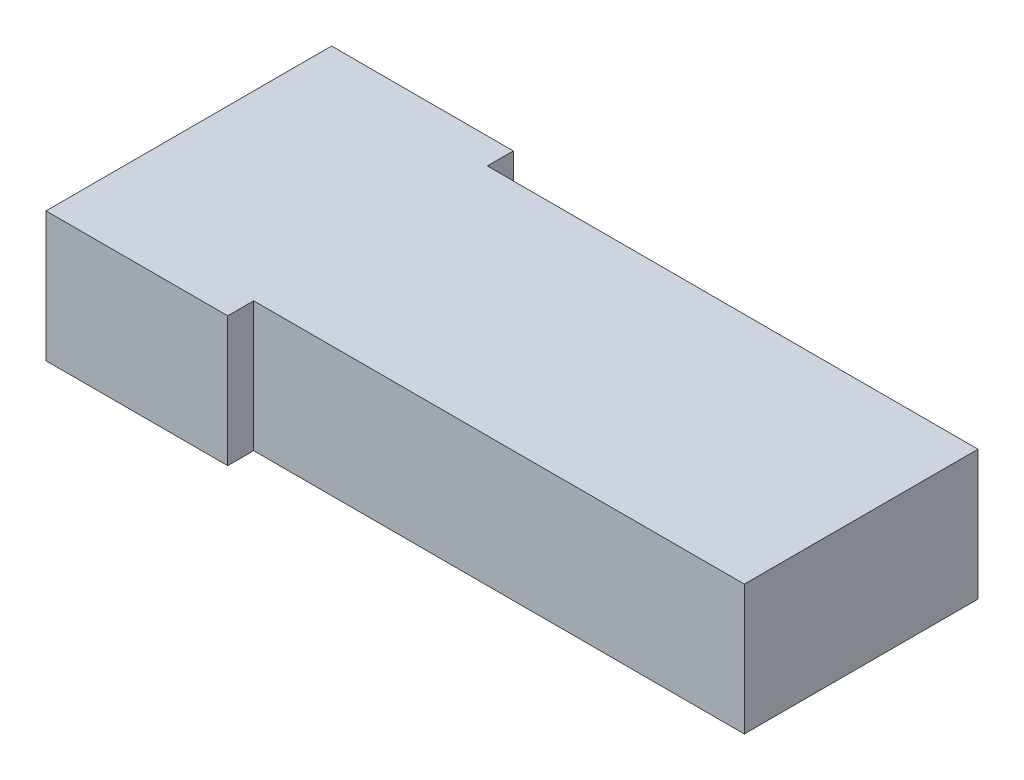
ISO-10303-21;
HEADER;
FILE_DESCRIPTION(('STEP AP214'),'2;1');
FILE_NAME('part.step','',(''),(''),'','','');
FILE_SCHEMA(('AUTOMOTIVE_DESIGN { 1 0 10303 214 1 1 1 1 }'));
ENDSEC;
DATA;
#1=APPLICATION_CONTEXT('core data for automotive mechanical design processes');
#2=APPLICATION_PROTOCOL_DEFINITION('international standard','automotive_design',2000,#1);
#3=PRODUCT_CONTEXT('',#1,'mechanical');
#4=PRODUCT('Part','Part','',(#3));
#5=PRODUCT_RELATED_PRODUCT_CATEGORY('part','',(#4));
#6=PRODUCT_DEFINITION_FORMATION('','',#4);
#7=PRODUCT_DEFINITION_CONTEXT('part definition',#1,'design');
#8=PRODUCT_DEFINITION('design','',#6,#7);
#9=PRODUCT_DEFINITION_SHAPE('','',#8);
#10=(LENGTH_UNIT() NAMED_UNIT(*) SI_UNIT(.MILLI.,.METRE.));
#11=(NAMED_UNIT(*) PLANE_ANGLE_UNIT() SI_UNIT($,.RADIAN.));
#12=(NAMED_UNIT(*) SI_UNIT($,.STERADIAN.) SOLID_ANGLE_UNIT());
#13=UNCERTAINTY_MEASURE_WITH_UNIT(LENGTH_MEASURE(1.E-05),#10,'distance_accuracy_value','');
#14=(GEOMETRIC_REPRESENTATION_CONTEXT(3) GLOBAL_UNCERTAINTY_ASSIGNED_CONTEXT((#13)) GLOBAL_UNIT_ASSIGNED_CONTEXT((#10,
#11,#12)) REPRESENTATION_CONTEXT('',''));
#15=CARTESIAN_POINT('',(0.,0.,0.));
#16=DIRECTION('',(0.,0.,1.));
#17=DIRECTION('',(1.,0.,0.));
#18=AXIS2_PLACEMENT_3D('',#15,#16,#17);
#19=CARTESIAN_POINT('',(0.,0.,0.));
#20=DIRECTION('',(0.,-1.,0.));
#21=DIRECTION('',(0.,0.,-1.));
#22=AXIS2_PLACEMENT_3D('',#19,#20,#21);
#23=PLANE('',#22);
#24=DIRECTION('',(0.,0.,1.));
#25=VECTOR('',#24,1.);
#26=CARTESIAN_POINT('',(7.5,0.,-4.5));
#27=LINE('',#26,#25);
#28=CARTESIAN_POINT('',(7.5,0.,-4.5));
#29=VERTEX_POINT('',#28);
#30=CARTESIAN_POINT('',(7.5,0.,-1.6));
#31=VERTEX_POINT('',#30);
#32=EDGE_CURVE('E309',#29,#31,#27,.T.);
#33=ORIENTED_EDGE('',*,*,#32,.T.);
#34=DIRECTION('',(-1.,0.,0.));
#35=VECTOR('',#34,1.);
#36=CARTESIAN_POINT('',(0.5,0.,-1.6));
#37=LINE('',#36,#35);
#38=CARTESIAN_POINT('',(0.5,0.,-1.6));
#39=VERTEX_POINT('',#38);
#40=EDGE_CURVE('E303',#31,#39,#37,.T.);
#41=ORIENTED_EDGE('',*,*,#40,.T.);
#42=DIRECTION('',(0.,0.,1.));
#43=VECTOR('',#42,1.);
#44=CARTESIAN_POINT('',(0.5,0.,1.6));
#45=LINE('',#44,#43);
#46=CARTESIAN_POINT('',(0.5,0.,1.6));
#47=VERTEX_POINT('',#46);
#48=EDGE_CURVE('E332',#39,#47,#45,.T.);
#49=ORIENTED_EDGE('',*,*,#48,.T.);
#50=DIRECTION('',(1.,0.,0.));
#51=VECTOR('',#50,1.);
#52=CARTESIAN_POINT('',(7.5,0.,1.6));
#53=LINE('',#52,#51);
#54=CARTESIAN_POINT('',(8.5,0.,1.6));
#55=VERTEX_POINT('',#54);
#56=EDGE_CURVE('E336',#47,#55,#53,.T.);
#57=ORIENTED_EDGE('',*,*,#56,.T.);
#58=DIRECTION('',(0.,0.,-1.));
#59=VECTOR('',#58,1.);
#60=CARTESIAN_POINT('',(8.5,0.,1.6));
#61=LINE('',#60,#59);
#62=CARTESIAN_POINT('',(8.5,0.,-4.5));
#63=VERTEX_POINT('',#62);
#64=EDGE_CURVE('E340',#55,#63,#61,.T.);
#65=ORIENTED_EDGE('',*,*,#64,.T.);
#66=DIRECTION('',(-1.,0.,0.));
#67=VECTOR('',#66,1.);
#68=CARTESIAN_POINT('',(-7.5,0.,-4.5));
#69=LINE('',#68,#67);
#70=CARTESIAN_POINT('',(9.9,0.,-4.5));
#71=VERTEX_POINT('',#70);
#72=EDGE_CURVE('E525',#71,#63,#69,.T.);
#73=ORIENTED_EDGE('',*,*,#72,.F.);
#74=DIRECTION('',(0.,0.,1.));
#75=VECTOR('',#74,1.);
#76=CARTESIAN_POINT('',(9.9,0.,-4.5));
#77=LINE('',#76,#75);
#78=CARTESIAN_POINT('',(9.9,0.,3.));
#79=VERTEX_POINT('',#78);
#80=EDGE_CURVE('E350',#71,#79,#77,.T.);
#81=ORIENTED_EDGE('',*,*,#80,.T.);
#82=DIRECTION('',(-1.,0.,0.));
#83=VECTOR('',#82,1.);
#84=CARTESIAN_POINT('',(7.5,0.,3.));
#85=LINE('',#84,#83);
#86=CARTESIAN_POINT('',(0.5,0.,3.));
#87=VERTEX_POINT('',#86);
#88=EDGE_CURVE('E410',#79,#87,#85,.T.);
#89=ORIENTED_EDGE('',*,*,#88,.T.);
#90=DIRECTION('',(0.,0.,1.));
#91=VECTOR('',#90,1.);
#92=CARTESIAN_POINT('',(0.5,0.,3.5));
#93=LINE('',#92,#91);
#94=CARTESIAN_POINT('',(0.5,0.,3.5));
#95=VERTEX_POINT('',#94);
#96=EDGE_CURVE('E414',#87,#95,#93,.T.);
#97=ORIENTED_EDGE('',*,*,#96,.T.);
#98=DIRECTION('',(-1.,0.,0.));
#99=VECTOR('',#98,1.);
#100=CARTESIAN_POINT('',(-14.5,0.,3.5));
#101=LINE('',#100,#99);
#102=CARTESIAN_POINT('',(-14.5,0.,3.5));
#103=VERTEX_POINT('',#102);
#104=EDGE_CURVE('E372',#95,#103,#101,.T.);
#105=ORIENTED_EDGE('',*,*,#104,.T.);
#106=DIRECTION('',(0.,0.,1.));
#107=VECTOR('',#106,1.);
#108=CARTESIAN_POINT('',(-14.5,0.,-5.5));
#109=LINE('',#108,#107);
#110=CARTESIAN_POINT('',(-14.5,0.,-3.5));
#111=VERTEX_POINT('',#110);
#112=EDGE_CURVE('E503',#111,#103,#109,.T.);
#113=ORIENTED_EDGE('',*,*,#112,.F.);
#114=DIRECTION('',(1.,0.,0.));
#115=VECTOR('',#114,1.);
#116=CARTESIAN_POINT('',(-14.5,0.,-3.5));
#117=LINE('',#116,#115);
#118=CARTESIAN_POINT('',(0.499999999999999,0.,-3.5));
#119=VERTEX_POINT('',#118);
#120=EDGE_CURVE('E472',#111,#119,#117,.T.);
#121=ORIENTED_EDGE('',*,*,#120,.T.);
#122=DIRECTION('',(0.,0.,1.));
#123=VECTOR('',#122,1.);
#124=CARTESIAN_POINT('',(0.499999999999999,0.,-3.5));
#125=LINE('',#124,#123);
#126=CARTESIAN_POINT('',(0.5,0.,-3.));
#127=VERTEX_POINT('',#126);
#128=EDGE_CURVE('E476',#119,#127,#125,.T.);
#129=ORIENTED_EDGE('',*,*,#128,.T.);
#130=DIRECTION('',(1.,0.,0.));
#131=VECTOR('',#130,1.);
#132=CARTESIAN_POINT('',(6.1,0.,-3.));
#133=LINE('',#132,#131);
#134=CARTESIAN_POINT('',(6.1,0.,-3.));
#135=VERTEX_POINT('',#134);
#136=EDGE_CURVE('E442',#127,#135,#133,.T.);
#137=ORIENTED_EDGE('',*,*,#136,.T.);
#138=DIRECTION('',(0.,0.,-1.));
#139=VECTOR('',#138,1.);
#140=CARTESIAN_POINT('',(6.1,0.,-4.5));
#141=LINE('',#140,#139);
#142=CARTESIAN_POINT('',(6.1,0.,-4.5));
#143=VERTEX_POINT('',#142);
#144=EDGE_CURVE('E424',#135,#143,#141,.T.);
#145=ORIENTED_EDGE('',*,*,#144,.T.);
#146=EDGE_CURVE('E487',#29,#143,#69,.T.);
#147=ORIENTED_EDGE('',*,*,#146,.F.);
#148=EDGE_LOOP('',(#33,#41,#49,#57,#65,#73,#81,#89,#97,#105,#113,#121,#129,#137,#145,#147));
#149=FACE_BOUND('',#148,.T.);
#150=ADVANCED_FACE('F39',(#149),#23,.T.);
#151=CARTESIAN_POINT('',(-7.5,2.,-4.5));
#152=DIRECTION('',(0.,0.,1.));
#153=DIRECTION('',(1.,0.,0.));
#154=AXIS2_PLACEMENT_3D('',#151,#152,#153);
#155=PLANE('',#154);
#156=DIRECTION('',(0.,-1.,0.));
#157=VECTOR('',#156,1.);
#158=CARTESIAN_POINT('',(11.4,2.,-4.5));
#159=LINE('',#158,#157);
#160=CARTESIAN_POINT('',(11.4,2.,-4.5));
#161=VERTEX_POINT('',#160);
#162=CARTESIAN_POINT('',(11.4,-3.,-4.5));
#163=VERTEX_POINT('',#162);
#164=EDGE_CURVE('E524',#161,#163,#159,.T.);
#165=ORIENTED_EDGE('',*,*,#164,.T.);
#166=DIRECTION('',(-1.,0.,0.));
#167=VECTOR('',#166,1.);
#168=CARTESIAN_POINT('',(11.4,-3.,-4.5));
#169=LINE('',#168,#167);
#170=CARTESIAN_POINT('',(9.9,-3.,-4.5));
#171=VERTEX_POINT('',#170);
#172=EDGE_CURVE('E371',#163,#171,#169,.T.);
#173=ORIENTED_EDGE('',*,*,#172,.T.);
#174=DIRECTION('',(0.,1.,0.));
#175=VECTOR('',#174,1.);
#176=CARTESIAN_POINT('',(9.9,-3.,-4.5));
#177=LINE('',#176,#175);
#178=EDGE_CURVE('E406',#171,#71,#177,.T.);
#179=ORIENTED_EDGE('',*,*,#178,.T.);
#180=ORIENTED_EDGE('',*,*,#72,.T.);
#181=DIRECTION('',(0.,1.,0.));
#182=VECTOR('',#181,1.);
#183=CARTESIAN_POINT('',(8.5,-3.,-4.5));
#184=LINE('',#183,#182);
#185=CARTESIAN_POINT('',(8.5,-3.,-4.5));
#186=VERTEX_POINT('',#185);
#187=EDGE_CURVE('E355',#186,#63,#184,.T.);
#188=ORIENTED_EDGE('',*,*,#187,.F.);
#189=DIRECTION('',(-1.,0.,0.));
#190=VECTOR('',#189,1.);
#191=CARTESIAN_POINT('',(8.5,-3.,-4.5));
#192=LINE('',#191,#190);
#193=CARTESIAN_POINT('',(7.5,-3.,-4.5));
#194=VERTEX_POINT('',#193);
#195=EDGE_CURVE('E320',#186,#194,#192,.T.);
#196=ORIENTED_EDGE('',*,*,#195,.T.);
#197=DIRECTION('',(0.,1.,0.));
#198=VECTOR('',#197,1.);
#199=CARTESIAN_POINT('',(7.5,-3.,-4.5));
#200=LINE('',#199,#198);
#201=EDGE_CURVE('E351',#194,#29,#200,.T.);
#202=ORIENTED_EDGE('',*,*,#201,.T.);
#203=ORIENTED_EDGE('',*,*,#146,.T.);
#204=DIRECTION('',(0.,1.,0.));
#205=VECTOR('',#204,1.);
#206=CARTESIAN_POINT('',(6.1,-3.,-4.5));
#207=LINE('',#206,#205);
#208=CARTESIAN_POINT('',(6.1,-3.,-4.5));
#209=VERTEX_POINT('',#208);
#210=EDGE_CURVE('E468',#209,#143,#207,.T.);
#211=ORIENTED_EDGE('',*,*,#210,.F.);
#212=DIRECTION('',(-1.,0.,0.));
#213=VECTOR('',#212,1.);
#214=CARTESIAN_POINT('',(6.1,-3.,-4.5));
#215=LINE('',#214,#213);
#216=CARTESIAN_POINT('',(-7.5,-3.,-4.5));
#217=VERTEX_POINT('',#216);
#218=EDGE_CURVE('E441',#209,#217,#215,.T.);
#219=ORIENTED_EDGE('',*,*,#218,.T.);
#220=DIRECTION('',(0.,-1.,0.));
#221=VECTOR('',#220,1.);
#222=CARTESIAN_POINT('',(-7.5,2.,-4.5));
#223=LINE('',#222,#221);
#224=CARTESIAN_POINT('',(-7.5,2.,-4.5));
#225=VERTEX_POINT('',#224);
#226=EDGE_CURVE('E552',#225,#217,#223,.T.);
#227=ORIENTED_EDGE('',*,*,#226,.F.);
#228=DIRECTION('',(-1.,0.,0.));
#229=VECTOR('',#228,1.);
#230=CARTESIAN_POINT('',(7.5,2.,-4.5));
#231=LINE('',#230,#229);
#232=EDGE_CURVE('E499',#161,#225,#231,.T.);
#233=ORIENTED_EDGE('',*,*,#232,.F.);
#234=EDGE_LOOP('',(#165,#173,#179,#180,#188,#196,#202,#203,#211,#219,#227,#233));
#235=FACE_BOUND('',#234,.T.);
#236=ADVANCED_FACE('F41',(#235),#155,.F.);
#237=CARTESIAN_POINT('',(-7.5,2.,-4.5));
#238=DIRECTION('',(-1.,0.,0.));
#239=DIRECTION('',(0.,0.,1.));
#240=AXIS2_PLACEMENT_3D('',#237,#238,#239);
#241=PLANE('',#240);
#242=DIRECTION('',(0.,0.,-1.));
#243=VECTOR('',#242,1.);
#244=CARTESIAN_POINT('',(-7.5,-3.,-4.5));
#245=LINE('',#244,#243);
#246=CARTESIAN_POINT('',(-7.5,-3.,-5.5));
#247=VERTEX_POINT('',#246);
#248=EDGE_CURVE('E446',#217,#247,#245,.T.);
#249=ORIENTED_EDGE('',*,*,#248,.T.);
#250=DIRECTION('',(0.,-1.,0.));
#251=VECTOR('',#250,1.);
#252=CARTESIAN_POINT('',(-7.5,2.,-5.5));
#253=LINE('',#252,#251);
#254=CARTESIAN_POINT('',(-7.5,2.,-5.5));
#255=VERTEX_POINT('',#254);
#256=EDGE_CURVE('E549',#255,#247,#253,.T.);
#257=ORIENTED_EDGE('',*,*,#256,.F.);
#258=DIRECTION('',(0.,0.,-1.));
#259=VECTOR('',#258,1.);
#260=CARTESIAN_POINT('',(-7.5,2.,-4.5));
#261=LINE('',#260,#259);
#262=EDGE_CURVE('E502',#225,#255,#261,.T.);
#263=ORIENTED_EDGE('',*,*,#262,.F.);
#264=ORIENTED_EDGE('',*,*,#226,.T.);
#265=EDGE_LOOP('',(#249,#257,#263,#264));
#266=FACE_BOUND('',#265,.T.);
#267=ADVANCED_FACE('F600',(#266),#241,.F.);
#268=CARTESIAN_POINT('',(-7.5,2.,-5.5));
#269=DIRECTION('',(0.,0.,1.));
#270=DIRECTION('',(1.,0.,0.));
#271=AXIS2_PLACEMENT_3D('',#268,#269,#270);
#272=PLANE('',#271);
#273=DIRECTION('',(-1.,0.,0.));
#274=VECTOR('',#273,1.);
#275=CARTESIAN_POINT('',(-7.5,-3.,-5.5));
#276=LINE('',#275,#274);
#277=CARTESIAN_POINT('',(-14.5,-3.,-5.5));
#278=VERTEX_POINT('',#277);
#279=EDGE_CURVE('E450',#247,#278,#276,.T.);
#280=ORIENTED_EDGE('',*,*,#279,.T.);
#281=DIRECTION('',(0.,-1.,0.));
#282=VECTOR('',#281,1.);
#283=CARTESIAN_POINT('',(-14.5,2.,-5.5));
#284=LINE('',#283,#282);
#285=CARTESIAN_POINT('',(-14.5,2.,-5.5));
#286=VERTEX_POINT('',#285);
#287=EDGE_CURVE('E546',#286,#278,#284,.T.);
#288=ORIENTED_EDGE('',*,*,#287,.F.);
#289=DIRECTION('',(-1.,0.,0.));
#290=VECTOR('',#289,1.);
#291=CARTESIAN_POINT('',(-7.5,2.,-5.5));
#292=LINE('',#291,#290);
#293=EDGE_CURVE('E506',#255,#286,#292,.T.);
#294=ORIENTED_EDGE('',*,*,#293,.F.);
#295=ORIENTED_EDGE('',*,*,#256,.T.);
#296=EDGE_LOOP('',(#280,#288,#294,#295));
#297=FACE_BOUND('',#296,.T.);
#298=ADVANCED_FACE('F596',(#297),#272,.F.);
#299=CARTESIAN_POINT('',(-14.5,2.,-5.5));
#300=DIRECTION('',(1.,0.,0.));
#301=DIRECTION('',(0.,0.,-1.));
#302=AXIS2_PLACEMENT_3D('',#299,#300,#301);
#303=PLANE('',#302);
#304=DIRECTION('',(0.,0.,1.));
#305=VECTOR('',#304,1.);
#306=CARTESIAN_POINT('',(-14.5,-3.,-5.5));
#307=LINE('',#306,#305);
#308=CARTESIAN_POINT('',(-14.5,-3.,-2.39113648292669));
#309=VERTEX_POINT('',#308);
#310=EDGE_CURVE('E454',#278,#309,#307,.T.);
#311=ORIENTED_EDGE('',*,*,#310,.T.);
#312=DIRECTION('',(0.,-1.,0.));
#313=VECTOR('',#312,1.);
#314=CARTESIAN_POINT('',(-14.5,-1.,-2.39113648292669));
#315=LINE('',#314,#313);
#316=CARTESIAN_POINT('',(-14.5,-1.,-2.39113648292669));
#317=VERTEX_POINT('',#316);
#318=EDGE_CURVE('E253',#317,#309,#315,.T.);
#319=ORIENTED_EDGE('',*,*,#318,.F.);
#320=DIRECTION('',(0.,0.,-1.));
#321=VECTOR('',#320,1.);
#322=CARTESIAN_POINT('',(-14.5,-1.,-5.5));
#323=LINE('',#322,#321);
#324=CARTESIAN_POINT('',(-14.5,-1.,-3.5));
#325=VERTEX_POINT('',#324);
#326=EDGE_CURVE('E254',#317,#325,#323,.T.);
#327=ORIENTED_EDGE('',*,*,#326,.T.);
#328=DIRECTION('',(0.,1.,0.));
#329=VECTOR('',#328,1.);
#330=CARTESIAN_POINT('',(-14.5,-3.,-3.5));
#331=LINE('',#330,#329);
#332=EDGE_CURVE('E58',#325,#111,#331,.T.);
#333=ORIENTED_EDGE('',*,*,#332,.T.);
#334=ORIENTED_EDGE('',*,*,#112,.T.);
#335=DIRECTION('',(0.,1.,0.));
#336=VECTOR('',#335,1.);
#337=CARTESIAN_POINT('',(-14.5,-3.,3.5));
#338=LINE('',#337,#336);
#339=CARTESIAN_POINT('',(-14.5,-1.,3.5));
#340=VERTEX_POINT('',#339);
#341=EDGE_CURVE('E421',#340,#103,#338,.T.);
#342=ORIENTED_EDGE('',*,*,#341,.F.);
#343=DIRECTION('',(0.,0.,-1.));
#344=VECTOR('',#343,1.);
#345=CARTESIAN_POINT('',(-14.5,-1.,5.5));
#346=LINE('',#345,#344);
#347=CARTESIAN_POINT('',(-14.5,-1.,2.39113648292669));
#348=VERTEX_POINT('',#347);
#349=EDGE_CURVE('E274',#340,#348,#346,.T.);
#350=ORIENTED_EDGE('',*,*,#349,.T.);
#351=DIRECTION('',(0.,-1.,0.));
#352=VECTOR('',#351,1.);
#353=CARTESIAN_POINT('',(-14.5,-1.,2.39113648292669));
#354=LINE('',#353,#352);
#355=CARTESIAN_POINT('',(-14.5,-3.,2.39113648292669));
#356=VERTEX_POINT('',#355);
#357=EDGE_CURVE('E286',#348,#356,#354,.T.);
#358=ORIENTED_EDGE('',*,*,#357,.T.);
#359=DIRECTION('',(0.,0.,1.));
#360=VECTOR('',#359,1.);
#361=CARTESIAN_POINT('',(-14.5,-3.,5.5));
#362=LINE('',#361,#360);
#363=CARTESIAN_POINT('',(-14.5,-3.,5.5));
#364=VERTEX_POINT('',#363);
#365=EDGE_CURVE('E390',#356,#364,#362,.T.);
#366=ORIENTED_EDGE('',*,*,#365,.T.);
#367=DIRECTION('',(0.,-1.,0.));
#368=VECTOR('',#367,1.);
#369=CARTESIAN_POINT('',(-14.5,2.,5.5));
#370=LINE('',#369,#368);
#371=CARTESIAN_POINT('',(-14.5,2.,5.5));
#372=VERTEX_POINT('',#371);
#373=EDGE_CURVE('E543',#372,#364,#370,.T.);
#374=ORIENTED_EDGE('',*,*,#373,.F.);
#375=DIRECTION('',(0.,0.,1.));
#376=VECTOR('',#375,1.);
#377=CARTESIAN_POINT('',(-14.5,2.,-5.5));
#378=LINE('',#377,#376);
#379=EDGE_CURVE('E509',#286,#372,#378,.T.);
#380=ORIENTED_EDGE('',*,*,#379,.F.);
#381=ORIENTED_EDGE('',*,*,#287,.T.);
#382=EDGE_LOOP('',(#311,#319,#327,#333,#334,#342,#350,#358,#366,#374,#380,#381));
#383=FACE_BOUND('',#382,.T.);
#384=ADVANCED_FACE('F564',(#383),#303,.F.);
#385=CARTESIAN_POINT('',(-14.5,2.,5.5));
#386=DIRECTION('',(0.,0.,-1.));
#387=DIRECTION('',(-1.,0.,0.));
#388=AXIS2_PLACEMENT_3D('',#385,#386,#387);
#389=PLANE('',#388);
#390=DIRECTION('',(1.,0.,0.));
#391=VECTOR('',#390,1.);
#392=CARTESIAN_POINT('',(-7.5,-3.,5.5));
#393=LINE('',#392,#391);
#394=CARTESIAN_POINT('',(-7.5,-3.,5.5));
#395=VERTEX_POINT('',#394);
#396=EDGE_CURVE('E394',#364,#395,#393,.T.);
#397=ORIENTED_EDGE('',*,*,#396,.T.);
#398=DIRECTION('',(0.,-1.,0.));
#399=VECTOR('',#398,1.);
#400=CARTESIAN_POINT('',(-7.5,2.,5.5));
#401=LINE('',#400,#399);
#402=CARTESIAN_POINT('',(-7.5,2.,5.5));
#403=VERTEX_POINT('',#402);
#404=EDGE_CURVE('E540',#403,#395,#401,.T.);
#405=ORIENTED_EDGE('',*,*,#404,.F.);
#406=DIRECTION('',(1.,0.,0.));
#407=VECTOR('',#406,1.);
#408=CARTESIAN_POINT('',(-14.5,2.,5.5));
#409=LINE('',#408,#407);
#410=EDGE_CURVE('E512',#372,#403,#409,.T.);
#411=ORIENTED_EDGE('',*,*,#410,.F.);
#412=ORIENTED_EDGE('',*,*,#373,.T.);
#413=EDGE_LOOP('',(#397,#405,#411,#412));
#414=FACE_BOUND('',#413,.T.);
#415=ADVANCED_FACE('F583',(#414),#389,.F.);
#416=CARTESIAN_POINT('',(-7.5,2.,5.5));
#417=DIRECTION('',(-1.,0.,0.));
#418=DIRECTION('',(0.,0.,1.));
#419=AXIS2_PLACEMENT_3D('',#416,#417,#418);
#420=PLANE('',#419);
#421=DIRECTION('',(0.,0.,-1.));
#422=VECTOR('',#421,1.);
#423=CARTESIAN_POINT('',(-7.5,-3.,4.5));
#424=LINE('',#423,#422);
#425=CARTESIAN_POINT('',(-7.5,-3.,4.5));
#426=VERTEX_POINT('',#425);
#427=EDGE_CURVE('E398',#395,#426,#424,.T.);
#428=ORIENTED_EDGE('',*,*,#427,.T.);
#429=DIRECTION('',(0.,-1.,0.));
#430=VECTOR('',#429,1.);
#431=CARTESIAN_POINT('',(-7.5,2.,4.5));
#432=LINE('',#431,#430);
#433=CARTESIAN_POINT('',(-7.5,2.,4.5));
#434=VERTEX_POINT('',#433);
#435=EDGE_CURVE('E537',#434,#426,#432,.T.);
#436=ORIENTED_EDGE('',*,*,#435,.F.);
#437=DIRECTION('',(0.,0.,-1.));
#438=VECTOR('',#437,1.);
#439=CARTESIAN_POINT('',(-7.5,2.,5.5));
#440=LINE('',#439,#438);
#441=EDGE_CURVE('E515',#403,#434,#440,.T.);
#442=ORIENTED_EDGE('',*,*,#441,.F.);
#443=ORIENTED_EDGE('',*,*,#404,.T.);
#444=EDGE_LOOP('',(#428,#436,#442,#443));
#445=FACE_BOUND('',#444,.T.);
#446=ADVANCED_FACE('F645',(#445),#420,.F.);
#447=CARTESIAN_POINT('',(11.4,2.,4.5));
#448=DIRECTION('',(0.,0.,-1.));
#449=DIRECTION('',(-1.,0.,0.));
#450=AXIS2_PLACEMENT_3D('',#447,#448,#449);
#451=PLANE('',#450);
#452=ORIENTED_EDGE('',*,*,#435,.T.);
#453=DIRECTION('',(1.,0.,0.));
#454=VECTOR('',#453,1.);
#455=CARTESIAN_POINT('',(-7.5,-3.,4.5));
#456=LINE('',#455,#454);
#457=CARTESIAN_POINT('',(11.4,-3.,4.5));
#458=VERTEX_POINT('',#457);
#459=EDGE_CURVE('E402',#426,#458,#456,.T.);
#460=ORIENTED_EDGE('',*,*,#459,.T.);
#461=DIRECTION('',(0.,-1.,0.));
#462=VECTOR('',#461,1.);
#463=CARTESIAN_POINT('',(11.4,2.,4.5));
#464=LINE('',#463,#462);
#465=CARTESIAN_POINT('',(11.4,2.,4.5));
#466=VERTEX_POINT('',#465);
#467=EDGE_CURVE('E534',#466,#458,#464,.T.);
#468=ORIENTED_EDGE('',*,*,#467,.F.);
#469=DIRECTION('',(1.,0.,0.));
#470=VECTOR('',#469,1.);
#471=CARTESIAN_POINT('',(-7.5,2.,4.5));
#472=LINE('',#471,#470);
#473=EDGE_CURVE('E518',#434,#466,#472,.T.);
#474=ORIENTED_EDGE('',*,*,#473,.F.);
#475=EDGE_LOOP('',(#452,#460,#468,#474));
#476=FACE_BOUND('',#475,.T.);
#477=ADVANCED_FACE('F643',(#476),#451,.F.);
#478=CARTESIAN_POINT('',(11.4,2.,-4.5));
#479=DIRECTION('',(-1.,0.,0.));
#480=DIRECTION('',(0.,0.,1.));
#481=AXIS2_PLACEMENT_3D('',#478,#479,#480);
#482=PLANE('',#481);
#483=ORIENTED_EDGE('',*,*,#467,.T.);
#484=DIRECTION('',(0.,0.,-1.));
#485=VECTOR('',#484,1.);
#486=CARTESIAN_POINT('',(11.4,-3.,4.5));
#487=LINE('',#486,#485);
#488=EDGE_CURVE('E367',#458,#163,#487,.T.);
#489=ORIENTED_EDGE('',*,*,#488,.T.);
#490=ORIENTED_EDGE('',*,*,#164,.F.);
#491=DIRECTION('',(0.,0.,-1.));
#492=VECTOR('',#491,1.);
#493=CARTESIAN_POINT('',(11.4,2.,-4.5));
#494=LINE('',#493,#492);
#495=EDGE_CURVE('E521',#466,#161,#494,.T.);
#496=ORIENTED_EDGE('',*,*,#495,.F.);
#497=EDGE_LOOP('',(#483,#489,#490,#496));
#498=FACE_BOUND('',#497,.T.);
#499=ADVANCED_FACE('F638',(#498),#482,.F.);
#500=CARTESIAN_POINT('',(0.,2.,0.));
#501=DIRECTION('',(0.,-1.,0.));
#502=DIRECTION('',(0.,0.,-1.));
#503=AXIS2_PLACEMENT_3D('',#500,#501,#502);
#504=PLANE('',#503);
#505=ORIENTED_EDGE('',*,*,#232,.T.);
#506=ORIENTED_EDGE('',*,*,#262,.T.);
#507=ORIENTED_EDGE('',*,*,#293,.T.);
#508=ORIENTED_EDGE('',*,*,#379,.T.);
#509=ORIENTED_EDGE('',*,*,#410,.T.);
#510=ORIENTED_EDGE('',*,*,#441,.T.);
#511=ORIENTED_EDGE('',*,*,#473,.T.);
#512=ORIENTED_EDGE('',*,*,#495,.T.);
#513=EDGE_LOOP('',(#505,#506,#507,#508,#509,#510,#511,#512));
#514=FACE_BOUND('',#513,.T.);
#515=ADVANCED_FACE('F586',(#514),#504,.F.);
#516=CARTESIAN_POINT('',(6.1,-3.,-4.5));
#517=DIRECTION('',(1.,0.,0.));
#518=DIRECTION('',(0.,0.,-1.));
#519=AXIS2_PLACEMENT_3D('',#516,#517,#518);
#520=PLANE('',#519);
#521=ORIENTED_EDGE('',*,*,#144,.F.);
#522=DIRECTION('',(0.,1.,0.));
#523=VECTOR('',#522,1.);
#524=CARTESIAN_POINT('',(6.1,-3.,-3.));
#525=LINE('',#524,#523);
#526=CARTESIAN_POINT('',(6.1,-3.,-3.));
#527=VERTEX_POINT('',#526);
#528=EDGE_CURVE('E483',#527,#135,#525,.T.);
#529=ORIENTED_EDGE('',*,*,#528,.F.);
#530=DIRECTION('',(0.,0.,-1.));
#531=VECTOR('',#530,1.);
#532=CARTESIAN_POINT('',(6.1,-3.,-4.5));
#533=LINE('',#532,#531);
#534=EDGE_CURVE('E437',#527,#209,#533,.T.);
#535=ORIENTED_EDGE('',*,*,#534,.T.);
#536=ORIENTED_EDGE('',*,*,#210,.T.);
#537=EDGE_LOOP('',(#521,#529,#535,#536));
#538=FACE_BOUND('',#537,.T.);
#539=ADVANCED_FACE('F608',(#538),#520,.T.);
#540=CARTESIAN_POINT('',(6.1,-3.,-3.));
#541=DIRECTION('',(0.,0.,1.));
#542=DIRECTION('',(1.,0.,0.));
#543=AXIS2_PLACEMENT_3D('',#540,#541,#542);
#544=PLANE('',#543);
#545=ORIENTED_EDGE('',*,*,#136,.F.);
#546=DIRECTION('',(0.,1.,0.));
#547=VECTOR('',#546,1.);
#548=CARTESIAN_POINT('',(0.5,-3.,-3.));
#549=LINE('',#548,#547);
#550=CARTESIAN_POINT('',(0.5,-3.,-3.));
#551=VERTEX_POINT('',#550);
#552=EDGE_CURVE('E488',#551,#127,#549,.T.);
#553=ORIENTED_EDGE('',*,*,#552,.F.);
#554=DIRECTION('',(1.,0.,0.));
#555=VECTOR('',#554,1.);
#556=CARTESIAN_POINT('',(6.1,-3.,-3.));
#557=LINE('',#556,#555);
#558=EDGE_CURVE('E464',#551,#527,#557,.T.);
#559=ORIENTED_EDGE('',*,*,#558,.T.);
#560=ORIENTED_EDGE('',*,*,#528,.T.);
#561=EDGE_LOOP('',(#545,#553,#559,#560));
#562=FACE_BOUND('',#561,.T.);
#563=ADVANCED_FACE('F613',(#562),#544,.T.);
#564=CARTESIAN_POINT('',(0.499999999999999,-3.,-3.5));
#565=DIRECTION('',(-1.,0.,0.));
#566=DIRECTION('',(0.,0.,1.));
#567=AXIS2_PLACEMENT_3D('',#564,#565,#566);
#568=PLANE('',#567);
#569=ORIENTED_EDGE('',*,*,#128,.F.);
#570=DIRECTION('',(0.,1.,0.));
#571=VECTOR('',#570,1.);
#572=CARTESIAN_POINT('',(0.499999999999999,-3.,-3.5));
#573=LINE('',#572,#571);
#574=CARTESIAN_POINT('',(0.499999999999999,-3.,-3.5));
#575=VERTEX_POINT('',#574);
#576=EDGE_CURVE('E491',#575,#119,#573,.T.);
#577=ORIENTED_EDGE('',*,*,#576,.F.);
#578=DIRECTION('',(0.,0.,1.));
#579=VECTOR('',#578,1.);
#580=CARTESIAN_POINT('',(0.499999999999999,-3.,-3.5));
#581=LINE('',#580,#579);
#582=EDGE_CURVE('E460',#575,#551,#581,.T.);
#583=ORIENTED_EDGE('',*,*,#582,.T.);
#584=ORIENTED_EDGE('',*,*,#552,.T.);
#585=EDGE_LOOP('',(#569,#577,#583,#584));
#586=FACE_BOUND('',#585,.T.);
#587=ADVANCED_FACE('F618',(#586),#568,.T.);
#588=CARTESIAN_POINT('',(-14.5,-3.,-3.5));
#589=DIRECTION('',(0.,0.,1.));
#590=DIRECTION('',(1.,0.,0.));
#591=AXIS2_PLACEMENT_3D('',#588,#589,#590);
#592=PLANE('',#591);
#593=DIRECTION('',(0.,1.,0.));
#594=VECTOR('',#593,1.);
#595=CARTESIAN_POINT('',(-7.5,-3.,-3.5));
#596=LINE('',#595,#594);
#597=CARTESIAN_POINT('',(-7.5,-3.,-3.5));
#598=VERTEX_POINT('',#597);
#599=CARTESIAN_POINT('',(-7.5,-1.,-3.5));
#600=VERTEX_POINT('',#599);
#601=EDGE_CURVE('E240',#598,#600,#596,.T.);
#602=ORIENTED_EDGE('',*,*,#601,.F.);
#603=DIRECTION('',(1.,0.,0.));
#604=VECTOR('',#603,1.);
#605=CARTESIAN_POINT('',(-14.5,-3.,-3.5));
#606=LINE('',#605,#604);
#607=EDGE_CURVE('E457',#598,#575,#606,.T.);
#608=ORIENTED_EDGE('',*,*,#607,.T.);
#609=ORIENTED_EDGE('',*,*,#576,.T.);
#610=ORIENTED_EDGE('',*,*,#120,.F.);
#611=ORIENTED_EDGE('',*,*,#332,.F.);
#612=DIRECTION('',(1.,0.,0.));
#613=VECTOR('',#612,1.);
#614=CARTESIAN_POINT('',(-14.5,-1.,-3.5));
#615=LINE('',#614,#613);
#616=EDGE_CURVE('E11',#325,#600,#615,.T.);
#617=ORIENTED_EDGE('',*,*,#616,.T.);
#618=EDGE_LOOP('',(#602,#608,#609,#610,#611,#617));
#619=FACE_BOUND('',#618,.T.);
#620=ADVANCED_FACE('F619',(#619),#592,.T.);
#621=CARTESIAN_POINT('',(0.,-3.,0.));
#622=DIRECTION('',(0.,-1.,0.));
#623=DIRECTION('',(0.,0.,-1.));
#624=AXIS2_PLACEMENT_3D('',#621,#622,#623);
#625=PLANE('',#624);
#626=ORIENTED_EDGE('',*,*,#607,.F.);
#627=DIRECTION('',(0.,0.,1.));
#628=VECTOR('',#627,1.);
#629=CARTESIAN_POINT('',(-7.5,-3.,-5.5));
#630=LINE('',#629,#628);
#631=CARTESIAN_POINT('',(-7.5,-3.,-2.39113648292669));
#632=VERTEX_POINT('',#631);
#633=EDGE_CURVE('E264',#598,#632,#630,.T.);
#634=ORIENTED_EDGE('',*,*,#633,.T.);
#635=DIRECTION('',(-1.,0.,0.));
#636=VECTOR('',#635,1.);
#637=CARTESIAN_POINT('',(-7.5,-3.,-2.39113648292669));
#638=LINE('',#637,#636);
#639=EDGE_CURVE('E245',#632,#309,#638,.T.);
#640=ORIENTED_EDGE('',*,*,#639,.T.);
#641=ORIENTED_EDGE('',*,*,#310,.F.);
#642=ORIENTED_EDGE('',*,*,#279,.F.);
#643=ORIENTED_EDGE('',*,*,#248,.F.);
#644=ORIENTED_EDGE('',*,*,#218,.F.);
#645=ORIENTED_EDGE('',*,*,#534,.F.);
#646=ORIENTED_EDGE('',*,*,#558,.F.);
#647=ORIENTED_EDGE('',*,*,#582,.F.);
#648=EDGE_LOOP('',(#626,#634,#640,#641,#642,#643,#644,#645,#646,#647));
#649=FACE_BOUND('',#648,.T.);
#650=ADVANCED_FACE('F594',(#649),#625,.T.);
#651=CARTESIAN_POINT('',(-14.5,-3.,3.5));
#652=DIRECTION('',(0.,0.,-1.));
#653=DIRECTION('',(-1.,0.,0.));
#654=AXIS2_PLACEMENT_3D('',#651,#652,#653);
#655=PLANE('',#654);
#656=DIRECTION('',(0.,-1.,0.));
#657=VECTOR('',#656,1.);
#658=CARTESIAN_POINT('',(-7.5,-3.,3.5));
#659=LINE('',#658,#657);
#660=CARTESIAN_POINT('',(-7.5,-1.,3.5));
#661=VERTEX_POINT('',#660);
#662=CARTESIAN_POINT('',(-7.5,-3.,3.5));
#663=VERTEX_POINT('',#662);
#664=EDGE_CURVE('E296',#661,#663,#659,.T.);
#665=ORIENTED_EDGE('',*,*,#664,.F.);
#666=DIRECTION('',(-1.,0.,0.));
#667=VECTOR('',#666,1.);
#668=CARTESIAN_POINT('',(-14.5,-1.,3.5));
#669=LINE('',#668,#667);
#670=EDGE_CURVE('E48',#661,#340,#669,.T.);
#671=ORIENTED_EDGE('',*,*,#670,.T.);
#672=ORIENTED_EDGE('',*,*,#341,.T.);
#673=ORIENTED_EDGE('',*,*,#104,.F.);
#674=DIRECTION('',(0.,1.,0.));
#675=VECTOR('',#674,1.);
#676=CARTESIAN_POINT('',(0.5,-3.,3.5));
#677=LINE('',#676,#675);
#678=CARTESIAN_POINT('',(0.5,-3.,3.5));
#679=VERTEX_POINT('',#678);
#680=EDGE_CURVE('E425',#679,#95,#677,.T.);
#681=ORIENTED_EDGE('',*,*,#680,.F.);
#682=DIRECTION('',(-1.,0.,0.));
#683=VECTOR('',#682,1.);
#684=CARTESIAN_POINT('',(-14.5,-3.,3.5));
#685=LINE('',#684,#683);
#686=EDGE_CURVE('E387',#679,#663,#685,.T.);
#687=ORIENTED_EDGE('',*,*,#686,.T.);
#688=EDGE_LOOP('',(#665,#671,#672,#673,#681,#687));
#689=FACE_BOUND('',#688,.T.);
#690=ADVANCED_FACE('F558',(#689),#655,.T.);
#691=CARTESIAN_POINT('',(0.5,-3.,3.5));
#692=DIRECTION('',(-1.,0.,0.));
#693=DIRECTION('',(0.,0.,1.));
#694=AXIS2_PLACEMENT_3D('',#691,#692,#693);
#695=PLANE('',#694);
#696=ORIENTED_EDGE('',*,*,#96,.F.);
#697=DIRECTION('',(0.,1.,0.));
#698=VECTOR('',#697,1.);
#699=CARTESIAN_POINT('',(0.5,-3.,3.));
#700=LINE('',#699,#698);
#701=CARTESIAN_POINT('',(0.5,-3.,3.));
#702=VERTEX_POINT('',#701);
#703=EDGE_CURVE('E428',#702,#87,#700,.T.);
#704=ORIENTED_EDGE('',*,*,#703,.F.);
#705=DIRECTION('',(0.,0.,1.));
#706=VECTOR('',#705,1.);
#707=CARTESIAN_POINT('',(0.5,-3.,3.5));
#708=LINE('',#707,#706);
#709=EDGE_CURVE('E383',#702,#679,#708,.T.);
#710=ORIENTED_EDGE('',*,*,#709,.T.);
#711=ORIENTED_EDGE('',*,*,#680,.T.);
#712=EDGE_LOOP('',(#696,#704,#710,#711));
#713=FACE_BOUND('',#712,.T.);
#714=ADVANCED_FACE('F626',(#713),#695,.T.);
#715=CARTESIAN_POINT('',(7.5,-3.,3.));
#716=DIRECTION('',(0.,0.,-1.));
#717=DIRECTION('',(-1.,0.,0.));
#718=AXIS2_PLACEMENT_3D('',#715,#716,#717);
#719=PLANE('',#718);
#720=ORIENTED_EDGE('',*,*,#88,.F.);
#721=DIRECTION('',(0.,1.,0.));
#722=VECTOR('',#721,1.);
#723=CARTESIAN_POINT('',(9.9,-3.,3.));
#724=LINE('',#723,#722);
#725=CARTESIAN_POINT('',(9.9,-3.,3.));
#726=VERTEX_POINT('',#725);
#727=EDGE_CURVE('E431',#726,#79,#724,.T.);
#728=ORIENTED_EDGE('',*,*,#727,.F.);
#729=DIRECTION('',(-1.,0.,0.));
#730=VECTOR('',#729,1.);
#731=CARTESIAN_POINT('',(9.9,-3.,3.));
#732=LINE('',#731,#730);
#733=EDGE_CURVE('E380',#726,#702,#732,.T.);
#734=ORIENTED_EDGE('',*,*,#733,.T.);
#735=ORIENTED_EDGE('',*,*,#703,.T.);
#736=EDGE_LOOP('',(#720,#728,#734,#735));
#737=FACE_BOUND('',#736,.T.);
#738=ADVANCED_FACE('F628',(#737),#719,.T.);
#739=CARTESIAN_POINT('',(9.9,-3.,-4.5));
#740=DIRECTION('',(-1.,0.,0.));
#741=DIRECTION('',(0.,0.,1.));
#742=AXIS2_PLACEMENT_3D('',#739,#740,#741);
#743=PLANE('',#742);
#744=ORIENTED_EDGE('',*,*,#80,.F.);
#745=ORIENTED_EDGE('',*,*,#178,.F.);
#746=DIRECTION('',(0.,0.,1.));
#747=VECTOR('',#746,1.);
#748=CARTESIAN_POINT('',(9.9,-3.,-4.5));
#749=LINE('',#748,#747);
#750=EDGE_CURVE('E376',#171,#726,#749,.T.);
#751=ORIENTED_EDGE('',*,*,#750,.T.);
#752=ORIENTED_EDGE('',*,*,#727,.T.);
#753=EDGE_LOOP('',(#744,#745,#751,#752));
#754=FACE_BOUND('',#753,.T.);
#755=ADVANCED_FACE('F633',(#754),#743,.T.);
#756=CARTESIAN_POINT('',(0.,-3.,0.));
#757=DIRECTION('',(0.,1.,0.));
#758=DIRECTION('',(0.,0.,1.));
#759=AXIS2_PLACEMENT_3D('',#756,#757,#758);
#760=PLANE('',#759);
#761=ORIENTED_EDGE('',*,*,#459,.F.);
#762=ORIENTED_EDGE('',*,*,#427,.F.);
#763=ORIENTED_EDGE('',*,*,#396,.F.);
#764=ORIENTED_EDGE('',*,*,#365,.F.);
#765=DIRECTION('',(1.,0.,0.));
#766=VECTOR('',#765,1.);
#767=CARTESIAN_POINT('',(-7.5,-3.,2.39113648292669));
#768=LINE('',#767,#766);
#769=CARTESIAN_POINT('',(-7.5,-3.,2.39113648292669));
#770=VERTEX_POINT('',#769);
#771=EDGE_CURVE('E273',#356,#770,#768,.T.);
#772=ORIENTED_EDGE('',*,*,#771,.T.);
#773=DIRECTION('',(0.,0.,1.));
#774=VECTOR('',#773,1.);
#775=CARTESIAN_POINT('',(-7.5,-3.,5.5));
#776=LINE('',#775,#774);
#777=EDGE_CURVE('E278',#770,#663,#776,.T.);
#778=ORIENTED_EDGE('',*,*,#777,.T.);
#779=ORIENTED_EDGE('',*,*,#686,.F.);
#780=ORIENTED_EDGE('',*,*,#709,.F.);
#781=ORIENTED_EDGE('',*,*,#733,.F.);
#782=ORIENTED_EDGE('',*,*,#750,.F.);
#783=ORIENTED_EDGE('',*,*,#172,.F.);
#784=ORIENTED_EDGE('',*,*,#488,.F.);
#785=EDGE_LOOP('',(#761,#762,#763,#764,#772,#778,#779,#780,#781,#782,#783,#784));
#786=FACE_BOUND('',#785,.T.);
#787=ADVANCED_FACE('F578',(#786),#760,.F.);
#788=CARTESIAN_POINT('',(0.5,-3.,-1.6));
#789=DIRECTION('',(0.,0.,-1.));
#790=DIRECTION('',(-1.,0.,0.));
#791=AXIS2_PLACEMENT_3D('',#788,#789,#790);
#792=PLANE('',#791);
#793=ORIENTED_EDGE('',*,*,#40,.F.);
#794=DIRECTION('',(0.,1.,0.));
#795=VECTOR('',#794,1.);
#796=CARTESIAN_POINT('',(7.5,-3.,-1.6));
#797=LINE('',#796,#795);
#798=CARTESIAN_POINT('',(7.5,-3.,-1.6));
#799=VERTEX_POINT('',#798);
#800=EDGE_CURVE('E347',#799,#31,#797,.T.);
#801=ORIENTED_EDGE('',*,*,#800,.F.);
#802=DIRECTION('',(-1.,0.,0.));
#803=VECTOR('',#802,1.);
#804=CARTESIAN_POINT('',(0.5,-3.,-1.6));
#805=LINE('',#804,#803);
#806=CARTESIAN_POINT('',(0.5,-3.,-1.6));
#807=VERTEX_POINT('',#806);
#808=EDGE_CURVE('E304',#799,#807,#805,.T.);
#809=ORIENTED_EDGE('',*,*,#808,.T.);
#810=DIRECTION('',(0.,1.,0.));
#811=VECTOR('',#810,1.);
#812=CARTESIAN_POINT('',(0.5,-3.,-1.6));
#813=LINE('',#812,#811);
#814=EDGE_CURVE('E328',#807,#39,#813,.T.);
#815=ORIENTED_EDGE('',*,*,#814,.T.);
#816=EDGE_LOOP('',(#793,#801,#809,#815));
#817=FACE_BOUND('',#816,.T.);
#818=ADVANCED_FACE('F690',(#817),#792,.T.);
#819=CARTESIAN_POINT('',(7.5,-3.,-4.5));
#820=DIRECTION('',(-1.,0.,0.));
#821=DIRECTION('',(0.,0.,1.));
#822=AXIS2_PLACEMENT_3D('',#819,#820,#821);
#823=PLANE('',#822);
#824=ORIENTED_EDGE('',*,*,#32,.F.);
#825=ORIENTED_EDGE('',*,*,#201,.F.);
#826=DIRECTION('',(0.,0.,1.));
#827=VECTOR('',#826,1.);
#828=CARTESIAN_POINT('',(7.5,-3.,-4.5));
#829=LINE('',#828,#827);
#830=EDGE_CURVE('E324',#194,#799,#829,.T.);
#831=ORIENTED_EDGE('',*,*,#830,.T.);
#832=ORIENTED_EDGE('',*,*,#800,.T.);
#833=EDGE_LOOP('',(#824,#825,#831,#832));
#834=FACE_BOUND('',#833,.T.);
#835=ADVANCED_FACE('F693',(#834),#823,.T.);
#836=CARTESIAN_POINT('',(8.5,-3.,1.6));
#837=DIRECTION('',(1.,0.,0.));
#838=DIRECTION('',(0.,0.,-1.));
#839=AXIS2_PLACEMENT_3D('',#836,#837,#838);
#840=PLANE('',#839);
#841=ORIENTED_EDGE('',*,*,#64,.F.);
#842=DIRECTION('',(0.,1.,0.));
#843=VECTOR('',#842,1.);
#844=CARTESIAN_POINT('',(8.5,-3.,1.6));
#845=LINE('',#844,#843);
#846=CARTESIAN_POINT('',(8.5,-3.,1.6));
#847=VERTEX_POINT('',#846);
#848=EDGE_CURVE('E358',#847,#55,#845,.T.);
#849=ORIENTED_EDGE('',*,*,#848,.F.);
#850=DIRECTION('',(0.,0.,-1.));
#851=VECTOR('',#850,1.);
#852=CARTESIAN_POINT('',(8.5,-3.,1.6));
#853=LINE('',#852,#851);
#854=EDGE_CURVE('E316',#847,#186,#853,.T.);
#855=ORIENTED_EDGE('',*,*,#854,.T.);
#856=ORIENTED_EDGE('',*,*,#187,.T.);
#857=EDGE_LOOP('',(#841,#849,#855,#856));
#858=FACE_BOUND('',#857,.T.);
#859=ADVANCED_FACE('F703',(#858),#840,.T.);
#860=CARTESIAN_POINT('',(7.5,-3.,1.6));
#861=DIRECTION('',(0.,0.,1.));
#862=DIRECTION('',(1.,0.,0.));
#863=AXIS2_PLACEMENT_3D('',#860,#861,#862);
#864=PLANE('',#863);
#865=ORIENTED_EDGE('',*,*,#56,.F.);
#866=DIRECTION('',(0.,1.,0.));
#867=VECTOR('',#866,1.);
#868=CARTESIAN_POINT('',(0.5,-3.,1.6));
#869=LINE('',#868,#867);
#870=CARTESIAN_POINT('',(0.5,-3.,1.6));
#871=VERTEX_POINT('',#870);
#872=EDGE_CURVE('E361',#871,#47,#869,.T.);
#873=ORIENTED_EDGE('',*,*,#872,.F.);
#874=DIRECTION('',(1.,0.,0.));
#875=VECTOR('',#874,1.);
#876=CARTESIAN_POINT('',(0.5,-3.,1.6));
#877=LINE('',#876,#875);
#878=EDGE_CURVE('E313',#871,#847,#877,.T.);
#879=ORIENTED_EDGE('',*,*,#878,.T.);
#880=ORIENTED_EDGE('',*,*,#848,.T.);
#881=EDGE_LOOP('',(#865,#873,#879,#880));
#882=FACE_BOUND('',#881,.T.);
#883=ADVANCED_FACE('F699',(#882),#864,.T.);
#884=CARTESIAN_POINT('',(0.5,-3.,1.6));
#885=DIRECTION('',(-1.,0.,0.));
#886=DIRECTION('',(0.,0.,1.));
#887=AXIS2_PLACEMENT_3D('',#884,#885,#886);
#888=PLANE('',#887);
#889=ORIENTED_EDGE('',*,*,#48,.F.);
#890=ORIENTED_EDGE('',*,*,#814,.F.);
#891=DIRECTION('',(0.,0.,1.));
#892=VECTOR('',#891,1.);
#893=CARTESIAN_POINT('',(0.5,-3.,1.6));
#894=LINE('',#893,#892);
#895=EDGE_CURVE('E308',#807,#871,#894,.T.);
#896=ORIENTED_EDGE('',*,*,#895,.T.);
#897=ORIENTED_EDGE('',*,*,#872,.T.);
#898=EDGE_LOOP('',(#889,#890,#896,#897));
#899=FACE_BOUND('',#898,.T.);
#900=ADVANCED_FACE('F695',(#899),#888,.T.);
#901=CARTESIAN_POINT('',(0.,-3.,0.));
#902=DIRECTION('',(0.,-1.,0.));
#903=DIRECTION('',(0.,0.,-1.));
#904=AXIS2_PLACEMENT_3D('',#901,#902,#903);
#905=PLANE('',#904);
#906=ORIENTED_EDGE('',*,*,#808,.F.);
#907=ORIENTED_EDGE('',*,*,#830,.F.);
#908=ORIENTED_EDGE('',*,*,#195,.F.);
#909=ORIENTED_EDGE('',*,*,#854,.F.);
#910=ORIENTED_EDGE('',*,*,#878,.F.);
#911=ORIENTED_EDGE('',*,*,#895,.F.);
#912=EDGE_LOOP('',(#906,#907,#908,#909,#910,#911));
#913=FACE_BOUND('',#912,.T.);
#914=ADVANCED_FACE('F698',(#913),#905,.T.);
#915=CARTESIAN_POINT('',(-7.5,-1.,5.5));
#916=DIRECTION('',(1.,0.,0.));
#917=DIRECTION('',(0.,0.,-1.));
#918=AXIS2_PLACEMENT_3D('',#915,#916,#917);
#919=PLANE('',#918);
#920=DIRECTION('',(0.,0.,1.));
#921=VECTOR('',#920,1.);
#922=CARTESIAN_POINT('',(-7.5,-1.,5.5));
#923=LINE('',#922,#921);
#924=CARTESIAN_POINT('',(-7.5,-1.,2.39113648292669));
#925=VERTEX_POINT('',#924);
#926=EDGE_CURVE('E282',#925,#661,#923,.T.);
#927=ORIENTED_EDGE('',*,*,#926,.T.);
#928=ORIENTED_EDGE('',*,*,#664,.T.);
#929=ORIENTED_EDGE('',*,*,#777,.F.);
#930=DIRECTION('',(0.,-1.,0.));
#931=VECTOR('',#930,1.);
#932=CARTESIAN_POINT('',(-7.5,-1.,2.39113648292669));
#933=LINE('',#932,#931);
#934=EDGE_CURVE('E293',#925,#770,#933,.T.);
#935=ORIENTED_EDGE('',*,*,#934,.F.);
#936=EDGE_LOOP('',(#927,#928,#929,#935));
#937=FACE_BOUND('',#936,.T.);
#938=ADVANCED_FACE('F713',(#937),#919,.T.);
#939=CARTESIAN_POINT('',(-7.5,-1.,2.39113648292669));
#940=DIRECTION('',(0.,0.,-1.));
#941=DIRECTION('',(-1.,0.,0.));
#942=AXIS2_PLACEMENT_3D('',#939,#940,#941);
#943=PLANE('',#942);
#944=ORIENTED_EDGE('',*,*,#771,.F.);
#945=ORIENTED_EDGE('',*,*,#357,.F.);
#946=DIRECTION('',(1.,0.,0.));
#947=VECTOR('',#946,1.);
#948=CARTESIAN_POINT('',(-7.5,-1.,2.39113648292669));
#949=LINE('',#948,#947);
#950=EDGE_CURVE('E277',#348,#925,#949,.T.);
#951=ORIENTED_EDGE('',*,*,#950,.T.);
#952=ORIENTED_EDGE('',*,*,#934,.T.);
#953=EDGE_LOOP('',(#944,#945,#951,#952));
#954=FACE_BOUND('',#953,.T.);
#955=ADVANCED_FACE('F571',(#954),#943,.T.);
#956=CARTESIAN_POINT('',(0.,-1.,0.));
#957=DIRECTION('',(0.,-1.,0.));
#958=DIRECTION('',(0.,0.,-1.));
#959=AXIS2_PLACEMENT_3D('',#956,#957,#958);
#960=PLANE('',#959);
#961=ORIENTED_EDGE('',*,*,#670,.F.);
#962=ORIENTED_EDGE('',*,*,#926,.F.);
#963=ORIENTED_EDGE('',*,*,#950,.F.);
#964=ORIENTED_EDGE('',*,*,#349,.F.);
#965=EDGE_LOOP('',(#961,#962,#963,#964));
#966=FACE_BOUND('',#965,.T.);
#967=ADVANCED_FACE('F568',(#966),#960,.F.);
#968=CARTESIAN_POINT('',(-7.5,-1.,-5.5));
#969=DIRECTION('',(1.,0.,0.));
#970=DIRECTION('',(0.,0.,-1.));
#971=AXIS2_PLACEMENT_3D('',#968,#969,#970);
#972=PLANE('',#971);
#973=ORIENTED_EDGE('',*,*,#633,.F.);
#974=ORIENTED_EDGE('',*,*,#601,.T.);
#975=DIRECTION('',(0.,0.,1.));
#976=VECTOR('',#975,1.);
#977=CARTESIAN_POINT('',(-7.5,-1.,-5.5));
#978=LINE('',#977,#976);
#979=CARTESIAN_POINT('',(-7.5,-1.,-2.39113648292669));
#980=VERTEX_POINT('',#979);
#981=EDGE_CURVE('E234',#600,#980,#978,.T.);
#982=ORIENTED_EDGE('',*,*,#981,.T.);
#983=DIRECTION('',(0.,-1.,0.));
#984=VECTOR('',#983,1.);
#985=CARTESIAN_POINT('',(-7.5,-1.,-2.39113648292669));
#986=LINE('',#985,#984);
#987=EDGE_CURVE('E238',#980,#632,#986,.T.);
#988=ORIENTED_EDGE('',*,*,#987,.T.);
#989=EDGE_LOOP('',(#973,#974,#982,#988));
#990=FACE_BOUND('',#989,.T.);
#991=ADVANCED_FACE('F237',(#990),#972,.T.);
#992=CARTESIAN_POINT('',(-7.5,-1.,-2.39113648292669));
#993=DIRECTION('',(0.,0.,1.));
#994=DIRECTION('',(1.,0.,0.));
#995=AXIS2_PLACEMENT_3D('',#992,#993,#994);
#996=PLANE('',#995);
#997=ORIENTED_EDGE('',*,*,#639,.F.);
#998=ORIENTED_EDGE('',*,*,#987,.F.);
#999=DIRECTION('',(-1.,0.,0.));
#1000=VECTOR('',#999,1.);
#1001=CARTESIAN_POINT('',(-7.5,-1.,-2.39113648292669));
#1002=LINE('',#1001,#1000);
#1003=EDGE_CURVE('E244',#980,#317,#1002,.T.);
#1004=ORIENTED_EDGE('',*,*,#1003,.T.);
#1005=ORIENTED_EDGE('',*,*,#318,.T.);
#1006=EDGE_LOOP('',(#997,#998,#1004,#1005));
#1007=FACE_BOUND('',#1006,.T.);
#1008=ADVANCED_FACE('F249',(#1007),#996,.T.);
#1009=CARTESIAN_POINT('',(0.,-1.,0.));
#1010=DIRECTION('',(0.,-1.,0.));
#1011=DIRECTION('',(0.,0.,-1.));
#1012=AXIS2_PLACEMENT_3D('',#1009,#1010,#1011);
#1013=PLANE('',#1012);
#1014=ORIENTED_EDGE('',*,*,#616,.F.);
#1015=ORIENTED_EDGE('',*,*,#326,.F.);
#1016=ORIENTED_EDGE('',*,*,#1003,.F.);
#1017=ORIENTED_EDGE('',*,*,#981,.F.);
#1018=EDGE_LOOP('',(#1014,#1015,#1016,#1017));
#1019=FACE_BOUND('',#1018,.T.);
#1020=ADVANCED_FACE('F257',(#1019),#1013,.F.);
#1021=CLOSED_SHELL('',(#150,#236,#267,#298,#384,#415,#446,#477,#499,#515,#539,#563,#587,#620,
#650,#690,#714,#738,#755,#787,#818,#835,#859,#883,#900,#914,#938,#955,#967,#991,#1008,#1020));
#1022=MANIFOLD_SOLID_BREP('B2',#1021);
#1023=ADVANCED_BREP_SHAPE_REPRESENTATION('',(#18,#1022),#14);
#1024=SHAPE_DEFINITION_REPRESENTATION(#9,#1023);
ENDSEC;
END-ISO-10303-21;
